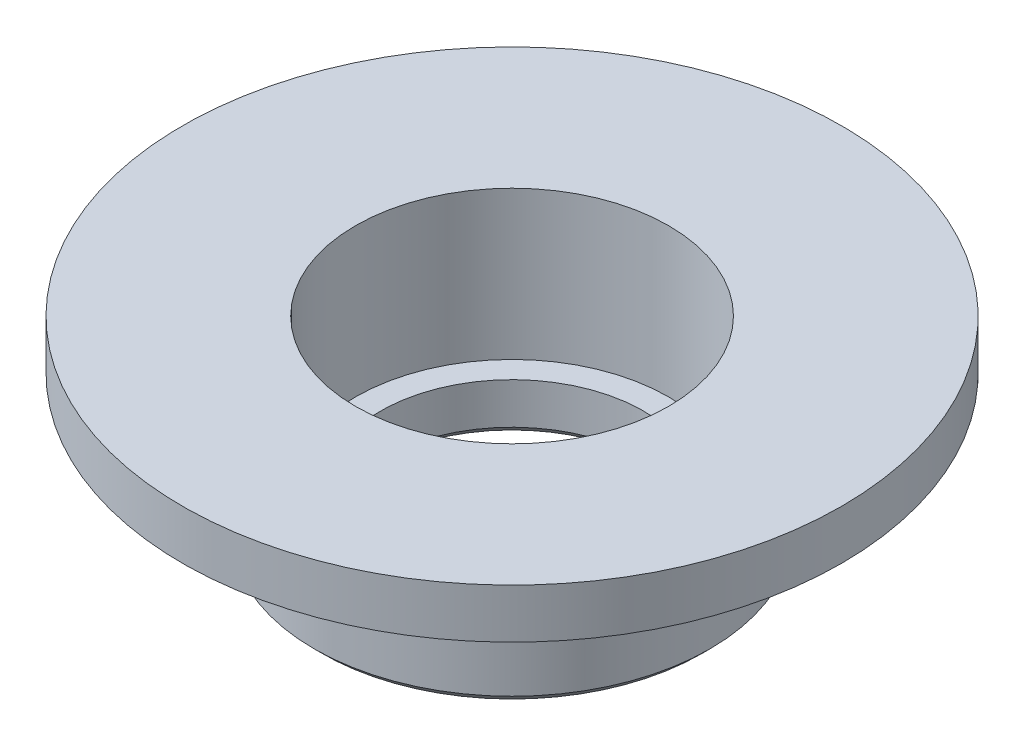
ISO-10303-21;
HEADER;
FILE_DESCRIPTION(('STEP AP214'),'2;1');
FILE_NAME('part.step','',(''),(''),'','','');
FILE_SCHEMA(('AUTOMOTIVE_DESIGN { 1 0 10303 214 1 1 1 1 }'));
ENDSEC;
DATA;
#1=APPLICATION_CONTEXT('core data for automotive mechanical design processes');
#2=APPLICATION_PROTOCOL_DEFINITION('international standard','automotive_design',2000,#1);
#3=PRODUCT_CONTEXT('',#1,'mechanical');
#4=PRODUCT('Part','Part','',(#3));
#5=PRODUCT_RELATED_PRODUCT_CATEGORY('part','',(#4));
#6=PRODUCT_DEFINITION_FORMATION('','',#4);
#7=PRODUCT_DEFINITION_CONTEXT('part definition',#1,'design');
#8=PRODUCT_DEFINITION('design','',#6,#7);
#9=PRODUCT_DEFINITION_SHAPE('','',#8);
#10=(LENGTH_UNIT() NAMED_UNIT(*) SI_UNIT(.MILLI.,.METRE.));
#11=(NAMED_UNIT(*) PLANE_ANGLE_UNIT() SI_UNIT($,.RADIAN.));
#12=(NAMED_UNIT(*) SI_UNIT($,.STERADIAN.) SOLID_ANGLE_UNIT());
#13=UNCERTAINTY_MEASURE_WITH_UNIT(LENGTH_MEASURE(1.E-05),#10,'distance_accuracy_value','');
#14=(GEOMETRIC_REPRESENTATION_CONTEXT(3) GLOBAL_UNCERTAINTY_ASSIGNED_CONTEXT((#13)) GLOBAL_UNIT_ASSIGNED_CONTEXT((#10,
#11,#12)) REPRESENTATION_CONTEXT('',''));
#15=CARTESIAN_POINT('',(0.,0.,0.));
#16=DIRECTION('',(0.,0.,1.));
#17=DIRECTION('',(1.,0.,0.));
#18=AXIS2_PLACEMENT_3D('',#15,#16,#17);
#19=CARTESIAN_POINT('',(0.,-37.4526355597513,0.));
#20=DIRECTION('',(0.,-1.,0.));
#21=DIRECTION('',(1.,0.,0.));
#22=AXIS2_PLACEMENT_3D('',#19,#20,#21);
#23=CYLINDRICAL_SURFACE('',#22,9.49999999999997);
#24=CARTESIAN_POINT('',(0.,-9.00000000000001,0.));
#25=DIRECTION('',(0.,-1.,0.));
#26=DIRECTION('',(1.,0.,0.));
#27=AXIS2_PLACEMENT_3D('',#24,#25,#26);
#28=CIRCLE('',#27,9.49999999999997);
#29=CARTESIAN_POINT('',(9.5,-9.,0.));
#30=VERTEX_POINT('',#29);
#31=EDGE_CURVE('E64',#30,#30,#28,.T.);
#32=ORIENTED_EDGE('',*,*,#31,.T.);
#33=EDGE_LOOP('',(#32));
#34=FACE_BOUND('',#33,.T.);
#35=CARTESIAN_POINT('',(0.,0.,0.));
#36=DIRECTION('',(0.,-1.,0.));
#37=DIRECTION('',(1.,0.,0.));
#38=AXIS2_PLACEMENT_3D('',#35,#36,#37);
#39=CIRCLE('',#38,9.49999999999997);
#40=CARTESIAN_POINT('',(9.5,0.,0.));
#41=VERTEX_POINT('',#40);
#42=EDGE_CURVE('E49',#41,#41,#39,.T.);
#43=ORIENTED_EDGE('',*,*,#42,.F.);
#44=EDGE_LOOP('',(#43));
#45=FACE_BOUND('',#44,.T.);
#46=ADVANCED_FACE('F29',(#34,#45),#23,.F.);
#47=CARTESIAN_POINT('',(9.5,0.,0.));
#48=DIRECTION('',(0.,1.,0.));
#49=DIRECTION('',(-1.,0.,0.));
#50=AXIS2_PLACEMENT_3D('',#47,#48,#49);
#51=PLANE('',#50);
#52=ORIENTED_EDGE('',*,*,#42,.T.);
#53=EDGE_LOOP('',(#52));
#54=FACE_BOUND('',#53,.T.);
#55=CARTESIAN_POINT('',(0.,0.,0.));
#56=DIRECTION('',(0.,-1.,0.));
#57=DIRECTION('',(1.,0.,0.));
#58=AXIS2_PLACEMENT_3D('',#55,#56,#57);
#59=CIRCLE('',#58,20.);
#60=CARTESIAN_POINT('',(20.,0.,0.));
#61=VERTEX_POINT('',#60);
#62=EDGE_CURVE('E52',#61,#61,#59,.T.);
#63=ORIENTED_EDGE('',*,*,#62,.F.);
#64=EDGE_LOOP('',(#63));
#65=FACE_BOUND('',#64,.T.);
#66=ADVANCED_FACE('F85',(#54,#65),#51,.T.);
#67=CARTESIAN_POINT('',(0.,-37.4526355597513,0.));
#68=DIRECTION('',(0.,-1.,0.));
#69=DIRECTION('',(1.,0.,0.));
#70=AXIS2_PLACEMENT_3D('',#67,#68,#69);
#71=CYLINDRICAL_SURFACE('',#70,20.);
#72=ORIENTED_EDGE('',*,*,#62,.T.);
#73=EDGE_LOOP('',(#72));
#74=FACE_BOUND('',#73,.T.);
#75=CARTESIAN_POINT('',(0.,-3.00000000000001,0.));
#76=DIRECTION('',(0.,-1.,0.));
#77=DIRECTION('',(1.,0.,0.));
#78=AXIS2_PLACEMENT_3D('',#75,#76,#77);
#79=CIRCLE('',#78,20.);
#80=CARTESIAN_POINT('',(20.,-3.00000000000001,0.));
#81=VERTEX_POINT('',#80);
#82=EDGE_CURVE('E55',#81,#81,#79,.T.);
#83=ORIENTED_EDGE('',*,*,#82,.F.);
#84=EDGE_LOOP('',(#83));
#85=FACE_BOUND('',#84,.T.);
#86=ADVANCED_FACE('F90',(#74,#85),#71,.T.);
#87=CARTESIAN_POINT('',(20.,-3.,0.));
#88=DIRECTION('',(0.,-1.,0.));
#89=DIRECTION('',(1.,0.,0.));
#90=AXIS2_PLACEMENT_3D('',#87,#88,#89);
#91=PLANE('',#90);
#92=ORIENTED_EDGE('',*,*,#82,.T.);
#93=EDGE_LOOP('',(#92));
#94=FACE_BOUND('',#93,.T.);
#95=CARTESIAN_POINT('',(0.,-3.,0.));
#96=DIRECTION('',(0.,-1.,0.));
#97=DIRECTION('',(1.,0.,0.));
#98=AXIS2_PLACEMENT_3D('',#95,#96,#97);
#99=CIRCLE('',#98,12.);
#100=CARTESIAN_POINT('',(12.,-3.,0.));
#101=VERTEX_POINT('',#100);
#102=EDGE_CURVE('E58',#101,#101,#99,.T.);
#103=ORIENTED_EDGE('',*,*,#102,.F.);
#104=EDGE_LOOP('',(#103));
#105=FACE_BOUND('',#104,.T.);
#106=ADVANCED_FACE('F96',(#94,#105),#91,.T.);
#107=CARTESIAN_POINT('',(0.,-37.4526355597513,0.));
#108=DIRECTION('',(0.,-1.,0.));
#109=DIRECTION('',(1.,0.,0.));
#110=AXIS2_PLACEMENT_3D('',#107,#108,#109);
#111=CYLINDRICAL_SURFACE('',#110,12.);
#112=CARTESIAN_POINT('',(0.,-11.5,0.));
#113=DIRECTION('',(0.,-1.,0.));
#114=DIRECTION('',(1.,0.,0.));
#115=AXIS2_PLACEMENT_3D('',#112,#113,#114);
#116=CIRCLE('',#115,12.);
#117=CARTESIAN_POINT('',(12.,-11.5,0.));
#118=VERTEX_POINT('',#117);
#119=EDGE_CURVE('E10',#118,#118,#116,.F.);
#120=ORIENTED_EDGE('',*,*,#119,.T.);
#121=EDGE_LOOP('',(#120));
#122=FACE_BOUND('',#121,.T.);
#123=ORIENTED_EDGE('',*,*,#102,.T.);
#124=EDGE_LOOP('',(#123));
#125=FACE_BOUND('',#124,.T.);
#126=ADVANCED_FACE('F100',(#122,#125),#111,.T.);
#127=CARTESIAN_POINT('',(12.,-12.,0.));
#128=DIRECTION('',(0.,-1.,0.));
#129=DIRECTION('',(1.,0.,0.));
#130=AXIS2_PLACEMENT_3D('',#127,#128,#129);
#131=PLANE('',#130);
#132=CARTESIAN_POINT('',(0.,-12.,0.));
#133=DIRECTION('',(0.,-1.,0.));
#134=DIRECTION('',(1.,0.,0.));
#135=AXIS2_PLACEMENT_3D('',#132,#133,#134);
#136=CIRCLE('',#135,8.49999999999996);
#137=CARTESIAN_POINT('',(8.49999999999999,-12.,0.));
#138=VERTEX_POINT('',#137);
#139=EDGE_CURVE('E36',#138,#138,#136,.F.);
#140=ORIENTED_EDGE('',*,*,#139,.T.);
#141=EDGE_LOOP('',(#140));
#142=FACE_BOUND('',#141,.T.);
#143=CARTESIAN_POINT('',(0.,-12.,0.));
#144=DIRECTION('',(0.,-1.,0.));
#145=DIRECTION('',(1.,0.,0.));
#146=AXIS2_PLACEMENT_3D('',#143,#144,#145);
#147=CIRCLE('',#146,11.5);
#148=CARTESIAN_POINT('',(11.5,-12.,0.));
#149=VERTEX_POINT('',#148);
#150=EDGE_CURVE('E40',#149,#149,#147,.T.);
#151=ORIENTED_EDGE('',*,*,#150,.T.);
#152=EDGE_LOOP('',(#151));
#153=FACE_BOUND('',#152,.T.);
#154=ADVANCED_FACE('F81',(#142,#153),#131,.T.);
#155=CARTESIAN_POINT('',(0.,-37.4526355597513,0.));
#156=DIRECTION('',(0.,-1.,0.));
#157=DIRECTION('',(1.,0.,0.));
#158=AXIS2_PLACEMENT_3D('',#155,#156,#157);
#159=CYLINDRICAL_SURFACE('',#158,7.99999999999997);
#160=CARTESIAN_POINT('',(0.,-11.5,0.));
#161=DIRECTION('',(0.,-1.,0.));
#162=DIRECTION('',(1.,0.,0.));
#163=AXIS2_PLACEMENT_3D('',#160,#161,#162);
#164=CIRCLE('',#163,7.99999999999997);
#165=CARTESIAN_POINT('',(8.,-11.5,0.));
#166=VERTEX_POINT('',#165);
#167=EDGE_CURVE('E44',#166,#166,#164,.T.);
#168=ORIENTED_EDGE('',*,*,#167,.T.);
#169=EDGE_LOOP('',(#168));
#170=FACE_BOUND('',#169,.T.);
#171=CARTESIAN_POINT('',(0.,-9.,0.));
#172=DIRECTION('',(0.,-1.,0.));
#173=DIRECTION('',(1.,0.,0.));
#174=AXIS2_PLACEMENT_3D('',#171,#172,#173);
#175=CIRCLE('',#174,7.99999999999997);
#176=CARTESIAN_POINT('',(8.,-9.,0.));
#177=VERTEX_POINT('',#176);
#178=EDGE_CURVE('E61',#177,#177,#175,.T.);
#179=ORIENTED_EDGE('',*,*,#178,.F.);
#180=EDGE_LOOP('',(#179));
#181=FACE_BOUND('',#180,.T.);
#182=ADVANCED_FACE('F73',(#170,#181),#159,.F.);
#183=CARTESIAN_POINT('',(8.,-9.,0.));
#184=DIRECTION('',(0.,1.,0.));
#185=DIRECTION('',(-1.,0.,0.));
#186=AXIS2_PLACEMENT_3D('',#183,#184,#185);
#187=PLANE('',#186);
#188=ORIENTED_EDGE('',*,*,#178,.T.);
#189=EDGE_LOOP('',(#188));
#190=FACE_BOUND('',#189,.T.);
#191=ORIENTED_EDGE('',*,*,#31,.F.);
#192=EDGE_LOOP('',(#191));
#193=FACE_BOUND('',#192,.T.);
#194=ADVANCED_FACE('F70',(#190,#193),#187,.T.);
#195=CARTESIAN_POINT('',(0.,-11.5,0.));
#196=DIRECTION('',(0.,-1.,0.));
#197=DIRECTION('',(1.,0.,0.));
#198=AXIS2_PLACEMENT_3D('',#195,#196,#197);
#199=CONICAL_SURFACE('',#198,7.99999999999997,0.78539816339744);
#200=ORIENTED_EDGE('',*,*,#139,.F.);
#201=EDGE_LOOP('',(#200));
#202=FACE_BOUND('',#201,.T.);
#203=ORIENTED_EDGE('',*,*,#167,.F.);
#204=EDGE_LOOP('',(#203));
#205=FACE_BOUND('',#204,.T.);
#206=ADVANCED_FACE('F72',(#202,#205),#199,.F.);
#207=CARTESIAN_POINT('',(0.,-12.,0.));
#208=DIRECTION('',(0.,1.,0.));
#209=DIRECTION('',(-1.,0.,0.));
#210=AXIS2_PLACEMENT_3D('',#207,#208,#209);
#211=CONICAL_SURFACE('',#210,11.5,0.785398163397443);
#212=ORIENTED_EDGE('',*,*,#119,.F.);
#213=EDGE_LOOP('',(#212));
#214=FACE_BOUND('',#213,.T.);
#215=ORIENTED_EDGE('',*,*,#150,.F.);
#216=EDGE_LOOP('',(#215));
#217=FACE_BOUND('',#216,.T.);
#218=ADVANCED_FACE('F31',(#214,#217),#211,.T.);
#219=CLOSED_SHELL('',(#46,#66,#86,#106,#126,#154,#182,#194,#206,#218));
#220=MANIFOLD_SOLID_BREP('B2',#219);
#221=ADVANCED_BREP_SHAPE_REPRESENTATION('',(#18,#220),#14);
#222=SHAPE_DEFINITION_REPRESENTATION(#9,#221);
ENDSEC;
END-ISO-10303-21;
